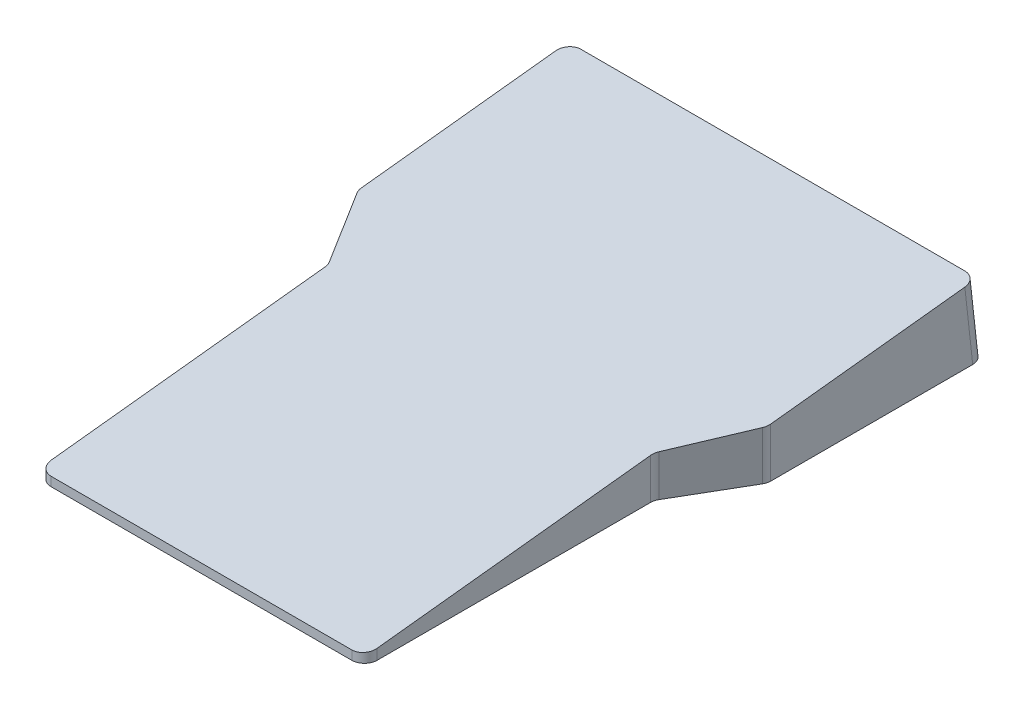
ISO-10303-21;
HEADER;
FILE_DESCRIPTION(('STEP AP214'),'2;1');
FILE_NAME('part.step','',(''),(''),'','','');
FILE_SCHEMA(('AUTOMOTIVE_DESIGN { 1 0 10303 214 1 1 1 1 }'));
ENDSEC;
DATA;
#1=APPLICATION_CONTEXT('core data for automotive mechanical design processes');
#2=APPLICATION_PROTOCOL_DEFINITION('international standard','automotive_design',2000,#1);
#3=PRODUCT_CONTEXT('',#1,'mechanical');
#4=PRODUCT('Part','Part','',(#3));
#5=PRODUCT_RELATED_PRODUCT_CATEGORY('part','',(#4));
#6=PRODUCT_DEFINITION_FORMATION('','',#4);
#7=PRODUCT_DEFINITION_CONTEXT('part definition',#1,'design');
#8=PRODUCT_DEFINITION('design','',#6,#7);
#9=PRODUCT_DEFINITION_SHAPE('','',#8);
#10=(LENGTH_UNIT() NAMED_UNIT(*) SI_UNIT(.MILLI.,.METRE.));
#11=(NAMED_UNIT(*) PLANE_ANGLE_UNIT() SI_UNIT($,.RADIAN.));
#12=(NAMED_UNIT(*) SI_UNIT($,.STERADIAN.) SOLID_ANGLE_UNIT());
#13=UNCERTAINTY_MEASURE_WITH_UNIT(LENGTH_MEASURE(1.E-05),#10,'distance_accuracy_value','');
#14=(GEOMETRIC_REPRESENTATION_CONTEXT(3) GLOBAL_UNCERTAINTY_ASSIGNED_CONTEXT((#13)) GLOBAL_UNIT_ASSIGNED_CONTEXT((#10,
#11,#12)) REPRESENTATION_CONTEXT('',''));
#15=CARTESIAN_POINT('',(0.,0.,0.));
#16=DIRECTION('',(0.,0.,1.));
#17=DIRECTION('',(1.,0.,0.));
#18=AXIS2_PLACEMENT_3D('',#15,#16,#17);
#19=CARTESIAN_POINT('',(0.,0.,0.));
#20=DIRECTION('',(0.,1.,0.));
#21=DIRECTION('',(0.,0.,1.));
#22=AXIS2_PLACEMENT_3D('',#19,#20,#21);
#23=PLANE('',#22);
#24=CARTESIAN_POINT('',(-49.597316240606,0.,6.94413092550791));
#25=DIRECTION('',(0.,1.,0.));
#26=DIRECTION('',(0.,0.,1.));
#27=AXIS2_PLACEMENT_3D('',#24,#25,#26);
#28=CIRCLE('',#27,2.35);
#29=CARTESIAN_POINT('',(-49.597316240606,0.,9.2941309255079));
#30=VERTEX_POINT('',#29);
#31=EDGE_CURVE('E274',#30,#30,#28,.F.);
#32=ORIENTED_EDGE('',*,*,#31,.F.);
#33=EDGE_LOOP('',(#32));
#34=FACE_BOUND('',#33,.T.);
#35=CARTESIAN_POINT('',(47.402683759394,0.,6.94413092550789));
#36=DIRECTION('',(0.,1.,0.));
#37=DIRECTION('',(0.,0.,1.));
#38=AXIS2_PLACEMENT_3D('',#35,#36,#37);
#39=CIRCLE('',#38,2.35);
#40=CARTESIAN_POINT('',(47.402683759394,0.,9.29413092550789));
#41=VERTEX_POINT('',#40);
#42=EDGE_CURVE('E386',#41,#41,#39,.F.);
#43=ORIENTED_EDGE('',*,*,#42,.F.);
#44=EDGE_LOOP('',(#43));
#45=FACE_BOUND('',#44,.T.);
#46=CARTESIAN_POINT('',(48.902683759394,0.,-45.3058690744921));
#47=DIRECTION('',(0.,1.,0.));
#48=DIRECTION('',(0.,0.,1.));
#49=AXIS2_PLACEMENT_3D('',#46,#47,#48);
#50=CIRCLE('',#49,2.4);
#51=CARTESIAN_POINT('',(48.902683759394,0.,-42.9058690744921));
#52=VERTEX_POINT('',#51);
#53=EDGE_CURVE('E383',#52,#52,#50,.F.);
#54=ORIENTED_EDGE('',*,*,#53,.F.);
#55=EDGE_LOOP('',(#54));
#56=FACE_BOUND('',#55,.T.);
#57=CARTESIAN_POINT('',(-51.097316240606,0.,-45.3058690744921));
#58=DIRECTION('',(0.,1.,0.));
#59=DIRECTION('',(0.,0.,1.));
#60=AXIS2_PLACEMENT_3D('',#57,#58,#59);
#61=CIRCLE('',#60,2.4);
#62=CARTESIAN_POINT('',(-51.097316240606,0.,-42.9058690744921));
#63=VERTEX_POINT('',#62);
#64=EDGE_CURVE('E380',#63,#63,#61,.F.);
#65=ORIENTED_EDGE('',*,*,#64,.F.);
#66=EDGE_LOOP('',(#65));
#67=FACE_BOUND('',#66,.T.);
#68=DIRECTION('',(1.,0.,0.));
#69=VECTOR('',#68,1.);
#70=CARTESIAN_POINT('',(0.,0.,-51.8058690744921));
#71=LINE('',#70,#69);
#72=CARTESIAN_POINT('',(-54.097316240606,0.,-51.8058690744921));
#73=VERTEX_POINT('',#72);
#74=CARTESIAN_POINT('',(51.902683759394,0.,-51.8058690744921));
#75=VERTEX_POINT('',#74);
#76=EDGE_CURVE('E246',#73,#75,#71,.T.);
#77=ORIENTED_EDGE('',*,*,#76,.T.);
#78=CARTESIAN_POINT('',(51.902683759394,0.,-48.2844070286295));
#79=DIRECTION('',(0.,1.,0.));
#80=DIRECTION('',(0.,0.,1.));
#81=AXIS2_PLACEMENT_3D('',#78,#79,#80);
#82=ELLIPSE('',#81,3.52146204586261,3.5);
#83=CARTESIAN_POINT('',(55.402683759394,0.,-48.2844070286295));
#84=VERTEX_POINT('',#83);
#85=EDGE_CURVE('E253',#75,#84,#82,.F.);
#86=ORIENTED_EDGE('',*,*,#85,.T.);
#87=DIRECTION('',(0.,0.,1.));
#88=VECTOR('',#87,1.);
#89=CARTESIAN_POINT('',(55.402683759394,0.,0.));
#90=LINE('',#89,#88);
#91=CARTESIAN_POINT('',(55.402683759394,0.,7.49938743866031));
#92=VERTEX_POINT('',#91);
#93=EDGE_CURVE('E264',#84,#92,#90,.T.);
#94=ORIENTED_EDGE('',*,*,#93,.T.);
#95=CARTESIAN_POINT('',(51.902683759394,0.,7.49938743866031));
#96=DIRECTION('',(0.,1.,0.));
#97=DIRECTION('',(0.,0.,1.));
#98=AXIS2_PLACEMENT_3D('',#95,#96,#97);
#99=CIRCLE('',#98,3.5);
#100=CARTESIAN_POINT('',(54.927297595843,0.,9.2605549889977));
#101=VERTEX_POINT('',#100);
#102=EDGE_CURVE('E271',#92,#101,#99,.F.);
#103=ORIENTED_EDGE('',*,*,#102,.T.);
#104=DIRECTION('',(0.503190728667824,0.,-0.864175381842566));
#105=VECTOR('',#104,1.);
#106=CARTESIAN_POINT('',(45.0465622981541,0.,26.2296438698113));
#107=LINE('',#106,#105);
#108=CARTESIAN_POINT('',(44.378069922945,0.,27.3777068620181));
#109=VERTEX_POINT('',#108);
#110=EDGE_CURVE('E336',#109,#101,#107,.T.);
#111=ORIENTED_EDGE('',*,*,#110,.F.);
#112=CARTESIAN_POINT('',(47.402683759394,0.,29.1388744123555));
#113=DIRECTION('',(0.,1.,0.));
#114=DIRECTION('',(0.,0.,1.));
#115=AXIS2_PLACEMENT_3D('',#112,#113,#114);
#116=CIRCLE('',#115,3.5);
#117=CARTESIAN_POINT('',(43.902683759394,0.,29.1388744123555));
#118=VERTEX_POINT('',#117);
#119=EDGE_CURVE('E139',#109,#118,#116,.T.);
#120=ORIENTED_EDGE('',*,*,#119,.T.);
#121=DIRECTION('',(0.,0.,1.));
#122=VECTOR('',#121,1.);
#123=CARTESIAN_POINT('',(43.902683759394,0.,0.));
#124=LINE('',#123,#122);
#125=CARTESIAN_POINT('',(43.902683759394,0.,104.694130925508));
#126=VERTEX_POINT('',#125);
#127=EDGE_CURVE('E335',#118,#126,#124,.T.);
#128=ORIENTED_EDGE('',*,*,#127,.T.);
#129=CARTESIAN_POINT('',(40.402683759394,0.,104.694130925508));
#130=DIRECTION('',(0.,1.,0.));
#131=DIRECTION('',(0.,0.,1.));
#132=AXIS2_PLACEMENT_3D('',#129,#130,#131);
#133=CIRCLE('',#132,3.5);
#134=CARTESIAN_POINT('',(40.402683759394,0.,108.194130925508));
#135=VERTEX_POINT('',#134);
#136=EDGE_CURVE('E279',#126,#135,#133,.F.);
#137=ORIENTED_EDGE('',*,*,#136,.T.);
#138=DIRECTION('',(1.,0.,0.));
#139=VECTOR('',#138,1.);
#140=CARTESIAN_POINT('',(0.,0.,108.194130925508));
#141=LINE('',#140,#139);
#142=CARTESIAN_POINT('',(-42.597316240606,0.,108.194130925508));
#143=VERTEX_POINT('',#142);
#144=EDGE_CURVE('E344',#143,#135,#141,.T.);
#145=ORIENTED_EDGE('',*,*,#144,.F.);
#146=CARTESIAN_POINT('',(-42.597316240606,0.,104.694130925508));
#147=DIRECTION('',(0.,1.,0.));
#148=DIRECTION('',(0.,0.,1.));
#149=AXIS2_PLACEMENT_3D('',#146,#147,#148);
#150=CIRCLE('',#149,3.5);
#151=CARTESIAN_POINT('',(-46.097316240606,0.,104.694130925508));
#152=VERTEX_POINT('',#151);
#153=EDGE_CURVE('E281',#143,#152,#150,.F.);
#154=ORIENTED_EDGE('',*,*,#153,.T.);
#155=DIRECTION('',(0.,0.,1.));
#156=VECTOR('',#155,1.);
#157=CARTESIAN_POINT('',(-46.097316240606,0.,0.));
#158=LINE('',#157,#156);
#159=CARTESIAN_POINT('',(-46.097316240606,0.,29.1388744123555));
#160=VERTEX_POINT('',#159);
#161=EDGE_CURVE('E374',#160,#152,#158,.T.);
#162=ORIENTED_EDGE('',*,*,#161,.F.);
#163=CARTESIAN_POINT('',(-49.597316240606,0.,29.1388744123555));
#164=DIRECTION('',(0.,1.,0.));
#165=DIRECTION('',(0.,0.,1.));
#166=AXIS2_PLACEMENT_3D('',#163,#164,#165);
#167=CIRCLE('',#166,3.5);
#168=CARTESIAN_POINT('',(-46.572702404157,0.,27.3777068620181));
#169=VERTEX_POINT('',#168);
#170=EDGE_CURVE('E329',#160,#169,#167,.T.);
#171=ORIENTED_EDGE('',*,*,#170,.T.);
#172=DIRECTION('',(0.503190728667823,0.,0.864175381842566));
#173=VECTOR('',#172,1.);
#174=CARTESIAN_POINT('',(-46.6855118392866,0.,27.1839689190783));
#175=LINE('',#174,#173);
#176=CARTESIAN_POINT('',(-57.121930077055,0.,9.2605549889977));
#177=VERTEX_POINT('',#176);
#178=EDGE_CURVE('E371',#177,#169,#175,.T.);
#179=ORIENTED_EDGE('',*,*,#178,.F.);
#180=CARTESIAN_POINT('',(-54.097316240606,0.,7.49938743866033));
#181=DIRECTION('',(0.,1.,0.));
#182=DIRECTION('',(0.,0.,1.));
#183=AXIS2_PLACEMENT_3D('',#180,#181,#182);
#184=CIRCLE('',#183,3.5);
#185=CARTESIAN_POINT('',(-57.597316240606,0.,7.49938743866033));
#186=VERTEX_POINT('',#185);
#187=EDGE_CURVE('E254',#177,#186,#184,.F.);
#188=ORIENTED_EDGE('',*,*,#187,.T.);
#189=DIRECTION('',(0.,0.,1.));
#190=VECTOR('',#189,1.);
#191=CARTESIAN_POINT('',(-57.597316240606,0.,0.));
#192=LINE('',#191,#190);
#193=CARTESIAN_POINT('',(-57.597316240606,0.,-48.2844070286295));
#194=VERTEX_POINT('',#193);
#195=EDGE_CURVE('E248',#194,#186,#192,.T.);
#196=ORIENTED_EDGE('',*,*,#195,.F.);
#197=CARTESIAN_POINT('',(-54.097316240606,0.,-48.2844070286295));
#198=DIRECTION('',(0.,1.,0.));
#199=DIRECTION('',(0.,0.,-1.));
#200=AXIS2_PLACEMENT_3D('',#197,#198,#199);
#201=ELLIPSE('',#200,3.52146204586261,3.5);
#202=EDGE_CURVE('E244',#194,#73,#201,.F.);
#203=ORIENTED_EDGE('',*,*,#202,.T.);
#204=EDGE_LOOP('',(#77,#86,#94,#103,#111,#120,#128,#137,#145,#154,#162,#171,#179,#188,#196,#203));
#205=FACE_BOUND('',#204,.T.);
#206=ADVANCED_FACE('F131',(#34,#45,#56,#67,#205),#23,.F.);
#207=CARTESIAN_POINT('',(45.0465622981541,20.,26.2296438698113));
#208=DIRECTION('',(-0.864175381842566,0.,-0.503190728667824));
#209=DIRECTION('',(-0.503190728667824,0.,0.864175381842566));
#210=AXIS2_PLACEMENT_3D('',#207,#208,#209);
#211=PLANE('',#210);
#212=DIRECTION('',(-0.500895165872153,-0.0954107678980578,0.860233002258697));
#213=VECTOR('',#212,1.);
#214=CARTESIAN_POINT('',(45.4484397145102,11.6674526644309,25.5394630895475));
#215=LINE('',#214,#213);
#216=CARTESIAN_POINT('',(54.927297595843,13.4729903714675,9.2605549889977));
#217=VERTEX_POINT('',#216);
#218=CARTESIAN_POINT('',(44.378069922945,11.463568077982,27.3777068620181));
#219=VERTEX_POINT('',#218);
#220=EDGE_CURVE('E348',#217,#219,#215,.T.);
#221=ORIENTED_EDGE('',*,*,#220,.T.);
#222=DIRECTION('',(0.,-1.,0.));
#223=VECTOR('',#222,1.);
#224=CARTESIAN_POINT('',(44.378069922945,20.,27.3777068620181));
#225=LINE('',#224,#223);
#226=EDGE_CURVE('E326',#219,#109,#225,.T.);
#227=ORIENTED_EDGE('',*,*,#226,.T.);
#228=ORIENTED_EDGE('',*,*,#110,.T.);
#229=DIRECTION('',(0.,-1.,0.));
#230=VECTOR('',#229,1.);
#231=CARTESIAN_POINT('',(54.927297595843,13.5635421715304,9.2605549889977));
#232=LINE('',#231,#230);
#233=EDGE_CURVE('E151',#101,#217,#232,.F.);
#234=ORIENTED_EDGE('',*,*,#233,.T.);
#235=EDGE_LOOP('',(#221,#227,#228,#234));
#236=FACE_BOUND('',#235,.T.);
#237=ADVANCED_FACE('F347',(#236),#211,.F.);
#238=CARTESIAN_POINT('',(-57.597316240606,20.,0.));
#239=DIRECTION('',(1.,0.,0.));
#240=DIRECTION('',(0.,0.,-1.));
#241=AXIS2_PLACEMENT_3D('',#238,#239,#240);
#242=PLANE('',#241);
#243=DIRECTION('',(0.,0.110236730398686,-0.993905359312952));
#244=VECTOR('',#243,1.);
#245=CARTESIAN_POINT('',(-57.5973162406061,14.3238963199093,1.58870206512229));
#246=LINE('',#245,#244);
#247=CARTESIAN_POINT('',(-57.5973162406061,13.6683262257461,7.49938743866033));
#248=VERTEX_POINT('',#247);
#249=CARTESIAN_POINT('',(-57.5973162406061,19.6141714436046,-46.1089462474171));
#250=VERTEX_POINT('',#249);
#251=EDGE_CURVE('E475',#248,#250,#246,.T.);
#252=ORIENTED_EDGE('',*,*,#251,.T.);
#253=DIRECTION('',(0.,-0.993905359312952,-0.110236730398682));
#254=VECTOR('',#253,1.);
#255=CARTESIAN_POINT('',(-57.597316240606,25.0472323891153,-45.5063507698115));
#256=LINE('',#255,#254);
#257=EDGE_CURVE('E303',#250,#194,#256,.T.);
#258=ORIENTED_EDGE('',*,*,#257,.T.);
#259=ORIENTED_EDGE('',*,*,#195,.T.);
#260=DIRECTION('',(0.,-1.,0.));
#261=VECTOR('',#260,1.);
#262=CARTESIAN_POINT('',(-57.597316240606,20.,7.49938743866033));
#263=LINE('',#262,#261);
#264=EDGE_CURVE('E301',#186,#248,#263,.F.);
#265=ORIENTED_EDGE('',*,*,#264,.T.);
#266=EDGE_LOOP('',(#252,#258,#259,#265));
#267=FACE_BOUND('',#266,.T.);
#268=ADVANCED_FACE('F421',(#267),#242,.F.);
#269=CARTESIAN_POINT('',(55.402683759394,20.,0.));
#270=DIRECTION('',(1.,0.,0.));
#271=DIRECTION('',(0.,0.,-1.));
#272=AXIS2_PLACEMENT_3D('',#269,#270,#271);
#273=PLANE('',#272);
#274=ORIENTED_EDGE('',*,*,#93,.F.);
#275=DIRECTION('',(0.,-0.993905359312952,-0.110236730398682));
#276=VECTOR('',#275,1.);
#277=CARTESIAN_POINT('',(55.402683759394,19.6141714436046,-46.1089462474171));
#278=LINE('',#277,#276);
#279=CARTESIAN_POINT('',(55.402683759394,19.6141714436046,-46.1089462474171));
#280=VERTEX_POINT('',#279);
#281=EDGE_CURVE('E288',#84,#280,#278,.F.);
#282=ORIENTED_EDGE('',*,*,#281,.T.);
#283=DIRECTION('',(0.,0.110236730398686,-0.993905359312952));
#284=VECTOR('',#283,1.);
#285=CARTESIAN_POINT('',(55.402683759394,14.3238963199093,1.58870206512224));
#286=LINE('',#285,#284);
#287=CARTESIAN_POINT('',(55.402683759394,13.6683262257461,7.49938743866031));
#288=VERTEX_POINT('',#287);
#289=EDGE_CURVE('E471',#288,#280,#286,.T.);
#290=ORIENTED_EDGE('',*,*,#289,.F.);
#291=DIRECTION('',(0.,-1.,0.));
#292=VECTOR('',#291,1.);
#293=CARTESIAN_POINT('',(55.402683759394,0.,7.49938743866031));
#294=LINE('',#293,#292);
#295=EDGE_CURVE('E285',#288,#92,#294,.T.);
#296=ORIENTED_EDGE('',*,*,#295,.T.);
#297=EDGE_LOOP('',(#274,#282,#290,#296));
#298=FACE_BOUND('',#297,.T.);
#299=ADVANCED_FACE('F408',(#298),#273,.T.);
#300=CARTESIAN_POINT('',(-46.097316240606,20.,0.));
#301=DIRECTION('',(1.,0.,0.));
#302=DIRECTION('',(0.,0.,-1.));
#303=AXIS2_PLACEMENT_3D('',#300,#301,#302);
#304=PLANE('',#303);
#305=DIRECTION('',(0.,0.110236730398686,-0.993905359312952));
#306=VECTOR('',#305,1.);
#307=CARTESIAN_POINT('',(-46.097316240606,14.5669390544892,-0.602595477605541));
#308=LINE('',#307,#306);
#309=CARTESIAN_POINT('',(-46.097316240606,2.88819446215896,104.694130925508));
#310=VERTEX_POINT('',#309);
#311=CARTESIAN_POINT('',(-46.097316240606,11.2682322237034,29.1388744123555));
#312=VERTEX_POINT('',#311);
#313=EDGE_CURVE('E356',#310,#312,#308,.T.);
#314=ORIENTED_EDGE('',*,*,#313,.T.);
#315=DIRECTION('',(0.,-1.,0.));
#316=VECTOR('',#315,1.);
#317=CARTESIAN_POINT('',(-46.097316240606,0.,29.1388744123555));
#318=LINE('',#317,#316);
#319=EDGE_CURVE('E312',#312,#160,#318,.T.);
#320=ORIENTED_EDGE('',*,*,#319,.T.);
#321=ORIENTED_EDGE('',*,*,#161,.T.);
#322=DIRECTION('',(0.,-1.,0.));
#323=VECTOR('',#322,1.);
#324=CARTESIAN_POINT('',(-46.097316240606,20.,104.694130925508));
#325=LINE('',#324,#323);
#326=EDGE_CURVE('E310',#152,#310,#325,.F.);
#327=ORIENTED_EDGE('',*,*,#326,.T.);
#328=EDGE_LOOP('',(#314,#320,#321,#327));
#329=FACE_BOUND('',#328,.T.);
#330=ADVANCED_FACE('F420',(#329),#304,.F.);
#331=CARTESIAN_POINT('',(0.,20.,108.194130925508));
#332=DIRECTION('',(0.,0.,-1.));
#333=DIRECTION('',(-1.,0.,0.));
#334=AXIS2_PLACEMENT_3D('',#331,#332,#333);
#335=PLANE('',#334);
#336=DIRECTION('',(1.,0.,0.));
#337=VECTOR('',#336,1.);
#338=CARTESIAN_POINT('',(-57.597316240606,2.5,108.194130925508));
#339=LINE('',#338,#337);
#340=CARTESIAN_POINT('',(-42.597316240606,2.5,108.194130925508));
#341=VERTEX_POINT('',#340);
#342=CARTESIAN_POINT('',(40.402683759394,2.5,108.194130925508));
#343=VERTEX_POINT('',#342);
#344=EDGE_CURVE('E481',#341,#343,#339,.T.);
#345=ORIENTED_EDGE('',*,*,#344,.F.);
#346=DIRECTION('',(0.,-1.,0.));
#347=VECTOR('',#346,1.);
#348=CARTESIAN_POINT('',(-42.597316240606,20.,108.194130925508));
#349=LINE('',#348,#347);
#350=EDGE_CURVE('E317',#341,#143,#349,.T.);
#351=ORIENTED_EDGE('',*,*,#350,.T.);
#352=ORIENTED_EDGE('',*,*,#144,.T.);
#353=DIRECTION('',(0.,-1.,0.));
#354=VECTOR('',#353,1.);
#355=CARTESIAN_POINT('',(40.402683759394,2.5,108.194130925508));
#356=LINE('',#355,#354);
#357=EDGE_CURVE('E315',#135,#343,#356,.F.);
#358=ORIENTED_EDGE('',*,*,#357,.T.);
#359=EDGE_LOOP('',(#345,#351,#352,#358));
#360=FACE_BOUND('',#359,.T.);
#361=ADVANCED_FACE('F425',(#360),#335,.F.);
#362=CARTESIAN_POINT('',(43.902683759394,20.,0.));
#363=DIRECTION('',(1.,0.,0.));
#364=DIRECTION('',(0.,0.,-1.));
#365=AXIS2_PLACEMENT_3D('',#362,#363,#364);
#366=PLANE('',#365);
#367=DIRECTION('',(0.,0.110236730398686,-0.993905359312952));
#368=VECTOR('',#367,1.);
#369=CARTESIAN_POINT('',(43.902683759394,14.5669390544892,-0.602595477605557));
#370=LINE('',#369,#368);
#371=CARTESIAN_POINT('',(43.902683759394,2.88819446215896,104.694130925508));
#372=VERTEX_POINT('',#371);
#373=CARTESIAN_POINT('',(43.902683759394,11.2682322237034,29.1388744123555));
#374=VERTEX_POINT('',#373);
#375=EDGE_CURVE('E351',#372,#374,#370,.T.);
#376=ORIENTED_EDGE('',*,*,#375,.F.);
#377=DIRECTION('',(0.,-1.,0.));
#378=VECTOR('',#377,1.);
#379=CARTESIAN_POINT('',(43.902683759394,0.,104.694130925508));
#380=LINE('',#379,#378);
#381=EDGE_CURVE('E322',#372,#126,#380,.T.);
#382=ORIENTED_EDGE('',*,*,#381,.T.);
#383=ORIENTED_EDGE('',*,*,#127,.F.);
#384=DIRECTION('',(0.,-1.,0.));
#385=VECTOR('',#384,1.);
#386=CARTESIAN_POINT('',(43.902683759394,20.,29.1388744123555));
#387=LINE('',#386,#385);
#388=EDGE_CURVE('E320',#118,#374,#387,.F.);
#389=ORIENTED_EDGE('',*,*,#388,.T.);
#390=EDGE_LOOP('',(#376,#382,#383,#389));
#391=FACE_BOUND('',#390,.T.);
#392=ADVANCED_FACE('F342',(#391),#366,.T.);
#393=CARTESIAN_POINT('',(-46.6855118392866,20.,27.1839689190783));
#394=DIRECTION('',(0.864175381842566,0.,-0.503190728667823));
#395=DIRECTION('',(-0.503190728667823,0.,-0.864175381842566));
#396=AXIS2_PLACEMENT_3D('',#393,#394,#395);
#397=PLANE('',#396);
#398=DIRECTION('',(-0.500895165872153,0.0954107678980579,-0.860233002258697));
#399=VECTOR('',#398,1.);
#400=CARTESIAN_POINT('',(-47.092447756713,11.5625694391,26.4851007130633));
#401=LINE('',#400,#399);
#402=CARTESIAN_POINT('',(-46.572702404157,11.463568077982,27.3777068620181));
#403=VERTEX_POINT('',#402);
#404=CARTESIAN_POINT('',(-57.121930077055,13.4729903714675,9.2605549889977));
#405=VERTEX_POINT('',#404);
#406=EDGE_CURVE('E269',#403,#405,#401,.T.);
#407=ORIENTED_EDGE('',*,*,#406,.T.);
#408=DIRECTION('',(0.,-1.,0.));
#409=VECTOR('',#408,1.);
#410=CARTESIAN_POINT('',(-57.121930077055,20.,9.2605549889977));
#411=LINE('',#410,#409);
#412=EDGE_CURVE('E307',#405,#177,#411,.T.);
#413=ORIENTED_EDGE('',*,*,#412,.T.);
#414=ORIENTED_EDGE('',*,*,#178,.T.);
#415=DIRECTION('',(0.,-1.,0.));
#416=VECTOR('',#415,1.);
#417=CARTESIAN_POINT('',(-46.572702404157,11.3730162779191,27.3777068620181));
#418=LINE('',#417,#416);
#419=EDGE_CURVE('E305',#169,#403,#418,.F.);
#420=ORIENTED_EDGE('',*,*,#419,.T.);
#421=EDGE_LOOP('',(#407,#413,#414,#420));
#422=FACE_BOUND('',#421,.T.);
#423=ADVANCED_FACE('F396',(#422),#397,.F.);
#424=CARTESIAN_POINT('',(-51.097316240606,-3.,-45.3058690744921));
#425=DIRECTION('',(0.,1.,0.));
#426=DIRECTION('',(0.,0.,1.));
#427=AXIS2_PLACEMENT_3D('',#424,#425,#426);
#428=CYLINDRICAL_SURFACE('',#427,2.4);
#429=CARTESIAN_POINT('',(-51.097316240606,-3.,-45.3058690744921));
#430=DIRECTION('',(0.,-1.,0.));
#431=DIRECTION('',(0.,0.,-1.));
#432=AXIS2_PLACEMENT_3D('',#429,#430,#431);
#433=CIRCLE('',#432,2.4);
#434=CARTESIAN_POINT('',(-51.097316240606,-3.,-47.7058690744921));
#435=VERTEX_POINT('',#434);
#436=EDGE_CURVE('E365',#435,#435,#433,.T.);
#437=ORIENTED_EDGE('',*,*,#436,.F.);
#438=EDGE_LOOP('',(#437));
#439=FACE_BOUND('',#438,.T.);
#440=ORIENTED_EDGE('',*,*,#64,.T.);
#441=EDGE_LOOP('',(#440));
#442=FACE_BOUND('',#441,.T.);
#443=ADVANCED_FACE('F403',(#439,#442),#428,.T.);
#444=CARTESIAN_POINT('',(-51.097316240606,-3.,-45.3058690744921));
#445=DIRECTION('',(0.,-1.,0.));
#446=DIRECTION('',(0.,0.,-1.));
#447=AXIS2_PLACEMENT_3D('',#444,#445,#446);
#448=PLANE('',#447);
#449=ORIENTED_EDGE('',*,*,#436,.T.);
#450=EDGE_LOOP('',(#449));
#451=FACE_BOUND('',#450,.T.);
#452=ADVANCED_FACE('F405',(#451),#448,.T.);
#453=CARTESIAN_POINT('',(48.902683759394,-3.,-45.3058690744921));
#454=DIRECTION('',(0.,1.,0.));
#455=DIRECTION('',(0.,0.,1.));
#456=AXIS2_PLACEMENT_3D('',#453,#454,#455);
#457=CYLINDRICAL_SURFACE('',#456,2.4);
#458=CARTESIAN_POINT('',(48.902683759394,-3.,-45.3058690744921));
#459=DIRECTION('',(0.,-1.,0.));
#460=DIRECTION('',(0.,0.,-1.));
#461=AXIS2_PLACEMENT_3D('',#458,#459,#460);
#462=CIRCLE('',#461,2.4);
#463=CARTESIAN_POINT('',(48.902683759394,-3.,-47.7058690744921));
#464=VERTEX_POINT('',#463);
#465=EDGE_CURVE('E362',#464,#464,#462,.T.);
#466=ORIENTED_EDGE('',*,*,#465,.F.);
#467=EDGE_LOOP('',(#466));
#468=FACE_BOUND('',#467,.T.);
#469=ORIENTED_EDGE('',*,*,#53,.T.);
#470=EDGE_LOOP('',(#469));
#471=FACE_BOUND('',#470,.T.);
#472=ADVANCED_FACE('F412',(#468,#471),#457,.T.);
#473=CARTESIAN_POINT('',(48.902683759394,-3.,-45.3058690744921));
#474=DIRECTION('',(0.,-1.,0.));
#475=DIRECTION('',(0.,0.,-1.));
#476=AXIS2_PLACEMENT_3D('',#473,#474,#475);
#477=PLANE('',#476);
#478=ORIENTED_EDGE('',*,*,#465,.T.);
#479=EDGE_LOOP('',(#478));
#480=FACE_BOUND('',#479,.T.);
#481=ADVANCED_FACE('F520',(#480),#477,.T.);
#482=CARTESIAN_POINT('',(47.402683759394,-3.,6.94413092550789));
#483=DIRECTION('',(0.,1.,0.));
#484=DIRECTION('',(0.,0.,1.));
#485=AXIS2_PLACEMENT_3D('',#482,#483,#484);
#486=CYLINDRICAL_SURFACE('',#485,2.35);
#487=CARTESIAN_POINT('',(47.402683759394,-3.,6.94413092550789));
#488=DIRECTION('',(0.,-1.,0.));
#489=DIRECTION('',(0.,0.,-1.));
#490=AXIS2_PLACEMENT_3D('',#487,#488,#489);
#491=CIRCLE('',#490,2.35);
#492=CARTESIAN_POINT('',(47.402683759394,-3.,4.5941309255079));
#493=VERTEX_POINT('',#492);
#494=EDGE_CURVE('E354',#493,#493,#491,.T.);
#495=ORIENTED_EDGE('',*,*,#494,.F.);
#496=EDGE_LOOP('',(#495));
#497=FACE_BOUND('',#496,.T.);
#498=ORIENTED_EDGE('',*,*,#42,.T.);
#499=EDGE_LOOP('',(#498));
#500=FACE_BOUND('',#499,.T.);
#501=ADVANCED_FACE('F517',(#497,#500),#486,.T.);
#502=CARTESIAN_POINT('',(47.402683759394,-3.,6.94413092550789));
#503=DIRECTION('',(0.,-1.,0.));
#504=DIRECTION('',(0.,0.,-1.));
#505=AXIS2_PLACEMENT_3D('',#502,#503,#504);
#506=PLANE('',#505);
#507=ORIENTED_EDGE('',*,*,#494,.T.);
#508=EDGE_LOOP('',(#507));
#509=FACE_BOUND('',#508,.T.);
#510=ADVANCED_FACE('F514',(#509),#506,.T.);
#511=CARTESIAN_POINT('',(-49.597316240606,-3.,6.94413092550791));
#512=DIRECTION('',(0.,1.,0.));
#513=DIRECTION('',(0.,0.,1.));
#514=AXIS2_PLACEMENT_3D('',#511,#512,#513);
#515=CYLINDRICAL_SURFACE('',#514,2.35);
#516=CARTESIAN_POINT('',(-49.597316240606,-3.,6.94413092550791));
#517=DIRECTION('',(0.,-1.,0.));
#518=DIRECTION('',(0.,0.,-1.));
#519=AXIS2_PLACEMENT_3D('',#516,#517,#518);
#520=CIRCLE('',#519,2.35);
#521=CARTESIAN_POINT('',(-49.597316240606,-3.,4.59413092550791));
#522=VERTEX_POINT('',#521);
#523=EDGE_CURVE('E350',#522,#522,#520,.T.);
#524=ORIENTED_EDGE('',*,*,#523,.F.);
#525=EDGE_LOOP('',(#524));
#526=FACE_BOUND('',#525,.T.);
#527=ORIENTED_EDGE('',*,*,#31,.T.);
#528=EDGE_LOOP('',(#527));
#529=FACE_BOUND('',#528,.T.);
#530=ADVANCED_FACE('F391',(#526,#529),#515,.T.);
#531=CARTESIAN_POINT('',(-49.597316240606,-3.,6.94413092550791));
#532=DIRECTION('',(0.,-1.,0.));
#533=DIRECTION('',(0.,0.,-1.));
#534=AXIS2_PLACEMENT_3D('',#531,#532,#533);
#535=PLANE('',#534);
#536=ORIENTED_EDGE('',*,*,#523,.T.);
#537=EDGE_LOOP('',(#536));
#538=FACE_BOUND('',#537,.T.);
#539=ADVANCED_FACE('F503',(#538),#535,.T.);
#540=CARTESIAN_POINT('',(-57.5973162406061,14.3238963199093,1.58870206512229));
#541=DIRECTION('',(0.,-0.993905359312952,-0.110236730398685));
#542=DIRECTION('',(0.,0.110236730398686,-0.993905359312952));
#543=AXIS2_PLACEMENT_3D('',#540,#541,#542);
#544=PLANE('',#543);
#545=ORIENTED_EDGE('',*,*,#289,.T.);
#546=CARTESIAN_POINT('',(51.902683759394,19.6141714436046,-46.1089462474171));
#547=DIRECTION('',(0.,-0.993905359312952,-0.110236730398685));
#548=DIRECTION('',(0.,0.110236730398686,-0.993905359312952));
#549=AXIS2_PLACEMENT_3D('',#546,#547,#548);
#550=CIRCLE('',#549,3.5);
#551=CARTESIAN_POINT('',(51.902683759394,20.,-49.5876150050124));
#552=VERTEX_POINT('',#551);
#553=EDGE_CURVE('E299',#280,#552,#550,.F.);
#554=ORIENTED_EDGE('',*,*,#553,.T.);
#555=DIRECTION('',(1.,0.,0.));
#556=VECTOR('',#555,1.);
#557=CARTESIAN_POINT('',(-57.5973162406061,20.,-49.5876150050124));
#558=LINE('',#557,#556);
#559=CARTESIAN_POINT('',(-54.097316240606,20.,-49.5876150050124));
#560=VERTEX_POINT('',#559);
#561=EDGE_CURVE('E478',#560,#552,#558,.T.);
#562=ORIENTED_EDGE('',*,*,#561,.F.);
#563=CARTESIAN_POINT('',(-54.097316240606,19.6141714436046,-46.108946247417));
#564=DIRECTION('',(0.,-0.993905359312952,-0.110236730398685));
#565=DIRECTION('',(0.,0.110236730398686,-0.993905359312952));
#566=AXIS2_PLACEMENT_3D('',#563,#564,#565);
#567=CIRCLE('',#566,3.5);
#568=EDGE_CURVE('E268',#560,#250,#567,.F.);
#569=ORIENTED_EDGE('',*,*,#568,.T.);
#570=ORIENTED_EDGE('',*,*,#251,.F.);
#571=CARTESIAN_POINT('',(-54.097316240606,13.6683262257461,7.49938743866033));
#572=DIRECTION('',(0.,-0.993905359312952,-0.110236730398685));
#573=DIRECTION('',(0.,-0.110236730398686,0.993905359312952));
#574=AXIS2_PLACEMENT_3D('',#571,#572,#573);
#575=ELLIPSE('',#574,3.52146204586261,3.5);
#576=EDGE_CURVE('E296',#248,#405,#575,.F.);
#577=ORIENTED_EDGE('',*,*,#576,.T.);
#578=ORIENTED_EDGE('',*,*,#406,.F.);
#579=CARTESIAN_POINT('',(-49.597316240606,11.2682322237034,29.1388744123555));
#580=DIRECTION('',(0.,-0.993905359312952,-0.110236730398685));
#581=DIRECTION('',(0.,0.110236730398686,-0.993905359312952));
#582=AXIS2_PLACEMENT_3D('',#579,#580,#581);
#583=ELLIPSE('',#582,3.52146204586261,3.5);
#584=EDGE_CURVE('E331',#403,#312,#583,.T.);
#585=ORIENTED_EDGE('',*,*,#584,.T.);
#586=ORIENTED_EDGE('',*,*,#313,.F.);
#587=CARTESIAN_POINT('',(-42.597316240606,2.88819446215896,104.694130925508));
#588=DIRECTION('',(0.,-0.993905359312952,-0.110236730398685));
#589=DIRECTION('',(0.,-0.110236730398686,0.993905359312952));
#590=AXIS2_PLACEMENT_3D('',#587,#588,#589);
#591=ELLIPSE('',#590,3.52146204586261,3.5);
#592=EDGE_CURVE('E294',#310,#341,#591,.F.);
#593=ORIENTED_EDGE('',*,*,#592,.T.);
#594=ORIENTED_EDGE('',*,*,#344,.T.);
#595=CARTESIAN_POINT('',(40.402683759394,2.88819446215896,104.694130925508));
#596=DIRECTION('',(0.,-0.993905359312952,-0.110236730398685));
#597=DIRECTION('',(0.,0.110236730398686,-0.993905359312952));
#598=AXIS2_PLACEMENT_3D('',#595,#596,#597);
#599=ELLIPSE('',#598,3.52146204586261,3.5);
#600=EDGE_CURVE('E292',#343,#372,#599,.F.);
#601=ORIENTED_EDGE('',*,*,#600,.T.);
#602=ORIENTED_EDGE('',*,*,#375,.T.);
#603=CARTESIAN_POINT('',(47.402683759394,11.2682322237034,29.1388744123555));
#604=DIRECTION('',(0.,-0.993905359312952,-0.110236730398685));
#605=DIRECTION('',(0.,-0.110236730398686,0.993905359312952));
#606=AXIS2_PLACEMENT_3D('',#603,#604,#605);
#607=ELLIPSE('',#606,3.52146204586261,3.5);
#608=EDGE_CURVE('E12',#374,#219,#607,.T.);
#609=ORIENTED_EDGE('',*,*,#608,.T.);
#610=ORIENTED_EDGE('',*,*,#220,.F.);
#611=CARTESIAN_POINT('',(51.902683759394,13.6683262257461,7.49938743866031));
#612=DIRECTION('',(0.,-0.993905359312952,-0.110236730398685));
#613=DIRECTION('',(0.,0.110236730398686,-0.993905359312952));
#614=AXIS2_PLACEMENT_3D('',#611,#612,#613);
#615=ELLIPSE('',#614,3.52146204586261,3.5);
#616=EDGE_CURVE('E290',#217,#288,#615,.F.);
#617=ORIENTED_EDGE('',*,*,#616,.T.);
#618=EDGE_LOOP('',(#545,#554,#562,#569,#570,#577,#578,#585,#586,#593,#594,#601,#602,#609,#610,#617));
#619=FACE_BOUND('',#618,.T.);
#620=ADVANCED_FACE('F470',(#619),#544,.F.);
#621=CARTESIAN_POINT('',(-57.5973162406061,5.67610368009048,-51.1763170701346));
#622=DIRECTION('',(0.,-0.110236730398682,0.993905359312952));
#623=DIRECTION('',(0.,-0.993905359312952,-0.110236730398682));
#624=AXIS2_PLACEMENT_3D('',#621,#622,#623);
#625=PLANE('',#624);
#626=ORIENTED_EDGE('',*,*,#561,.T.);
#627=DIRECTION('',(0.,-0.993905359312952,-0.110236730398682));
#628=VECTOR('',#627,1.);
#629=CARTESIAN_POINT('',(51.902683759394,0.,-51.8058690744921));
#630=LINE('',#629,#628);
#631=EDGE_CURVE('E263',#552,#75,#630,.T.);
#632=ORIENTED_EDGE('',*,*,#631,.T.);
#633=ORIENTED_EDGE('',*,*,#76,.F.);
#634=DIRECTION('',(0.,-0.993905359312952,-0.110236730398682));
#635=VECTOR('',#634,1.);
#636=CARTESIAN_POINT('',(-54.097316240606,5.67610368009048,-51.1763170701346));
#637=LINE('',#636,#635);
#638=EDGE_CURVE('E260',#73,#560,#637,.F.);
#639=ORIENTED_EDGE('',*,*,#638,.T.);
#640=EDGE_LOOP('',(#626,#632,#633,#639));
#641=FACE_BOUND('',#640,.T.);
#642=ADVANCED_FACE('F259',(#641),#625,.F.);
#643=CARTESIAN_POINT('',(51.902683759394,5.2902751236951,-47.6976483125393));
#644=DIRECTION('',(0.,0.993905359312952,0.110236730398682));
#645=DIRECTION('',(0.,-0.110236730398682,0.993905359312952));
#646=AXIS2_PLACEMENT_3D('',#643,#644,#645);
#647=CYLINDRICAL_SURFACE('',#646,3.5);
#648=ORIENTED_EDGE('',*,*,#553,.F.);
#649=ORIENTED_EDGE('',*,*,#281,.F.);
#650=ORIENTED_EDGE('',*,*,#85,.F.);
#651=ORIENTED_EDGE('',*,*,#631,.F.);
#652=EDGE_LOOP('',(#648,#649,#650,#651));
#653=FACE_BOUND('',#652,.T.);
#654=ADVANCED_FACE('F439',(#653),#647,.T.);
#655=CARTESIAN_POINT('',(-54.097316240606,25.0472323891153,-45.5063507698115));
#656=DIRECTION('',(0.,-0.993905359312952,-0.110236730398682));
#657=DIRECTION('',(0.,0.110236730398682,-0.993905359312952));
#658=AXIS2_PLACEMENT_3D('',#655,#656,#657);
#659=CYLINDRICAL_SURFACE('',#658,3.5);
#660=ORIENTED_EDGE('',*,*,#568,.F.);
#661=ORIENTED_EDGE('',*,*,#638,.F.);
#662=ORIENTED_EDGE('',*,*,#202,.F.);
#663=ORIENTED_EDGE('',*,*,#257,.F.);
#664=EDGE_LOOP('',(#660,#661,#662,#663));
#665=FACE_BOUND('',#664,.T.);
#666=ADVANCED_FACE('F267',(#665),#659,.T.);
#667=CARTESIAN_POINT('',(-54.097316240606,20.,7.49938743866033));
#668=DIRECTION('',(0.,-1.,0.));
#669=DIRECTION('',(0.,0.,-1.));
#670=AXIS2_PLACEMENT_3D('',#667,#668,#669);
#671=CYLINDRICAL_SURFACE('',#670,3.5);
#672=ORIENTED_EDGE('',*,*,#576,.F.);
#673=ORIENTED_EDGE('',*,*,#264,.F.);
#674=ORIENTED_EDGE('',*,*,#187,.F.);
#675=ORIENTED_EDGE('',*,*,#412,.F.);
#676=EDGE_LOOP('',(#672,#673,#674,#675));
#677=FACE_BOUND('',#676,.T.);
#678=ADVANCED_FACE('F445',(#677),#671,.T.);
#679=CARTESIAN_POINT('',(-49.597316240606,20.,29.1388744123555));
#680=DIRECTION('',(0.,1.,0.));
#681=DIRECTION('',(0.,0.,1.));
#682=AXIS2_PLACEMENT_3D('',#679,#680,#681);
#683=CYLINDRICAL_SURFACE('',#682,3.5);
#684=ORIENTED_EDGE('',*,*,#584,.F.);
#685=ORIENTED_EDGE('',*,*,#419,.F.);
#686=ORIENTED_EDGE('',*,*,#170,.F.);
#687=ORIENTED_EDGE('',*,*,#319,.F.);
#688=EDGE_LOOP('',(#684,#685,#686,#687));
#689=FACE_BOUND('',#688,.T.);
#690=ADVANCED_FACE('F448',(#689),#683,.F.);
#691=CARTESIAN_POINT('',(-42.597316240606,20.,104.694130925508));
#692=DIRECTION('',(0.,-1.,0.));
#693=DIRECTION('',(0.,0.,-1.));
#694=AXIS2_PLACEMENT_3D('',#691,#692,#693);
#695=CYLINDRICAL_SURFACE('',#694,3.5);
#696=ORIENTED_EDGE('',*,*,#592,.F.);
#697=ORIENTED_EDGE('',*,*,#326,.F.);
#698=ORIENTED_EDGE('',*,*,#153,.F.);
#699=ORIENTED_EDGE('',*,*,#350,.F.);
#700=EDGE_LOOP('',(#696,#697,#698,#699));
#701=FACE_BOUND('',#700,.T.);
#702=ADVANCED_FACE('F452',(#701),#695,.T.);
#703=CARTESIAN_POINT('',(40.402683759394,20.,104.694130925508));
#704=DIRECTION('',(0.,1.,0.));
#705=DIRECTION('',(0.,0.,1.));
#706=AXIS2_PLACEMENT_3D('',#703,#704,#705);
#707=CYLINDRICAL_SURFACE('',#706,3.5);
#708=ORIENTED_EDGE('',*,*,#600,.F.);
#709=ORIENTED_EDGE('',*,*,#357,.F.);
#710=ORIENTED_EDGE('',*,*,#136,.F.);
#711=ORIENTED_EDGE('',*,*,#381,.F.);
#712=EDGE_LOOP('',(#708,#709,#710,#711));
#713=FACE_BOUND('',#712,.T.);
#714=ADVANCED_FACE('F456',(#713),#707,.T.);
#715=CARTESIAN_POINT('',(47.402683759394,20.,29.1388744123555));
#716=DIRECTION('',(0.,-1.,0.));
#717=DIRECTION('',(0.,0.,-1.));
#718=AXIS2_PLACEMENT_3D('',#715,#716,#717);
#719=CYLINDRICAL_SURFACE('',#718,3.5);
#720=ORIENTED_EDGE('',*,*,#608,.F.);
#721=ORIENTED_EDGE('',*,*,#388,.F.);
#722=ORIENTED_EDGE('',*,*,#119,.F.);
#723=ORIENTED_EDGE('',*,*,#226,.F.);
#724=EDGE_LOOP('',(#720,#721,#722,#723));
#725=FACE_BOUND('',#724,.T.);
#726=ADVANCED_FACE('F346',(#725),#719,.F.);
#727=CARTESIAN_POINT('',(51.902683759394,20.,7.49938743866031));
#728=DIRECTION('',(0.,1.,0.));
#729=DIRECTION('',(0.,0.,1.));
#730=AXIS2_PLACEMENT_3D('',#727,#728,#729);
#731=CYLINDRICAL_SURFACE('',#730,3.5);
#732=ORIENTED_EDGE('',*,*,#616,.F.);
#733=ORIENTED_EDGE('',*,*,#233,.F.);
#734=ORIENTED_EDGE('',*,*,#102,.F.);
#735=ORIENTED_EDGE('',*,*,#295,.F.);
#736=EDGE_LOOP('',(#732,#733,#734,#735));
#737=FACE_BOUND('',#736,.T.);
#738=ADVANCED_FACE('F133',(#737),#731,.T.);
#739=CLOSED_SHELL('',(#206,#237,#268,#299,#330,#361,#392,#423,#443,#452,#472,#481,#501,#510,
#530,#539,#620,#642,#654,#666,#678,#690,#702,#714,#726,#738));
#740=MANIFOLD_SOLID_BREP('B2',#739);
#741=ADVANCED_BREP_SHAPE_REPRESENTATION('',(#18,#740),#14);
#742=SHAPE_DEFINITION_REPRESENTATION(#9,#741);
ENDSEC;
END-ISO-10303-21;
